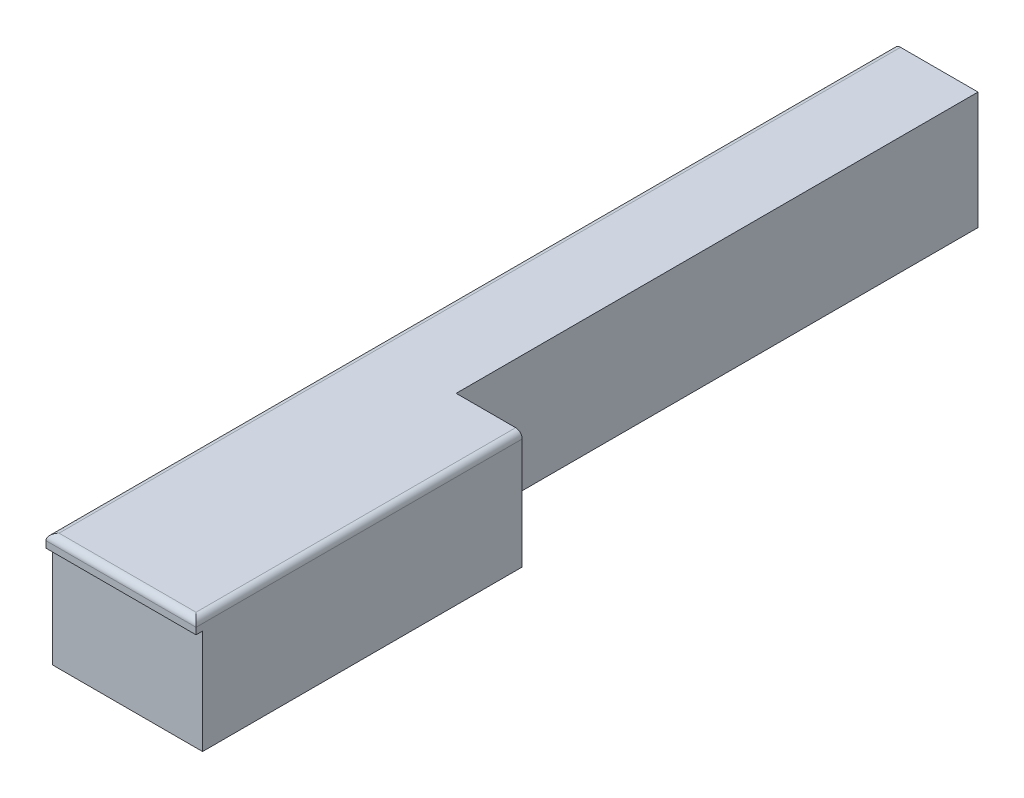
ISO-10303-21;
HEADER;
FILE_DESCRIPTION(('STEP AP214'),'2;1');
FILE_NAME('part.step','',(''),(''),'','','');
FILE_SCHEMA(('AUTOMOTIVE_DESIGN { 1 0 10303 214 1 1 1 1 }'));
ENDSEC;
DATA;
#1=APPLICATION_CONTEXT('core data for automotive mechanical design processes');
#2=APPLICATION_PROTOCOL_DEFINITION('international standard','automotive_design',2000,#1);
#3=PRODUCT_CONTEXT('',#1,'mechanical');
#4=PRODUCT('Part','Part','',(#3));
#5=PRODUCT_RELATED_PRODUCT_CATEGORY('part','',(#4));
#6=PRODUCT_DEFINITION_FORMATION('','',#4);
#7=PRODUCT_DEFINITION_CONTEXT('part definition',#1,'design');
#8=PRODUCT_DEFINITION('design','',#6,#7);
#9=PRODUCT_DEFINITION_SHAPE('','',#8);
#10=(LENGTH_UNIT() NAMED_UNIT(*) SI_UNIT(.MILLI.,.METRE.));
#11=(NAMED_UNIT(*) PLANE_ANGLE_UNIT() SI_UNIT($,.RADIAN.));
#12=(NAMED_UNIT(*) SI_UNIT($,.STERADIAN.) SOLID_ANGLE_UNIT());
#13=UNCERTAINTY_MEASURE_WITH_UNIT(LENGTH_MEASURE(1.E-05),#10,'distance_accuracy_value','');
#14=(GEOMETRIC_REPRESENTATION_CONTEXT(3) GLOBAL_UNCERTAINTY_ASSIGNED_CONTEXT((#13)) GLOBAL_UNIT_ASSIGNED_CONTEXT((#10,
#11,#12)) REPRESENTATION_CONTEXT('',''));
#15=CARTESIAN_POINT('',(0.,0.,0.));
#16=DIRECTION('',(0.,0.,1.));
#17=DIRECTION('',(1.,0.,0.));
#18=AXIS2_PLACEMENT_3D('',#15,#16,#17);
#19=CARTESIAN_POINT('',(0.,18.,-50.));
#20=DIRECTION('',(0.,0.,1.));
#21=DIRECTION('',(1.,0.,0.));
#22=AXIS2_PLACEMENT_3D('',#19,#20,#21);
#23=PLANE('',#22);
#24=DIRECTION('',(-1.,0.,0.));
#25=VECTOR('',#24,1.);
#26=CARTESIAN_POINT('',(0.,18.,-50.));
#27=LINE('',#26,#25);
#28=CARTESIAN_POINT('',(22.,18.,-50.));
#29=VERTEX_POINT('',#28);
#30=CARTESIAN_POINT('',(12.875,18.,-50.));
#31=VERTEX_POINT('',#30);
#32=EDGE_CURVE('E137',#29,#31,#27,.T.);
#33=ORIENTED_EDGE('',*,*,#32,.F.);
#34=CARTESIAN_POINT('',(22.,17.,-50.));
#35=DIRECTION('',(0.,0.,1.));
#36=DIRECTION('',(1.,0.,0.));
#37=AXIS2_PLACEMENT_3D('',#34,#35,#36);
#38=CIRCLE('',#37,0.999999999999997);
#39=CARTESIAN_POINT('',(23.,17.,-50.));
#40=VERTEX_POINT('',#39);
#41=EDGE_CURVE('E59',#29,#40,#38,.F.);
#42=ORIENTED_EDGE('',*,*,#41,.T.);
#43=DIRECTION('',(0.,-1.,0.));
#44=VECTOR('',#43,1.);
#45=CARTESIAN_POINT('',(23.,18.,-50.));
#46=LINE('',#45,#44);
#47=CARTESIAN_POINT('',(23.,0.,-50.));
#48=VERTEX_POINT('',#47);
#49=EDGE_CURVE('E146',#40,#48,#46,.T.);
#50=ORIENTED_EDGE('',*,*,#49,.T.);
#51=DIRECTION('',(-1.,0.,0.));
#52=VECTOR('',#51,1.);
#53=CARTESIAN_POINT('',(0.,0.,-50.));
#54=LINE('',#53,#52);
#55=CARTESIAN_POINT('',(12.875,0.,-50.));
#56=VERTEX_POINT('',#55);
#57=EDGE_CURVE('E136',#48,#56,#54,.T.);
#58=ORIENTED_EDGE('',*,*,#57,.T.);
#59=DIRECTION('',(0.,-1.,0.));
#60=VECTOR('',#59,1.);
#61=CARTESIAN_POINT('',(12.875,18.,-50.));
#62=LINE('',#61,#60);
#63=EDGE_CURVE('E157',#31,#56,#62,.T.);
#64=ORIENTED_EDGE('',*,*,#63,.F.);
#65=EDGE_LOOP('',(#33,#42,#50,#58,#64));
#66=FACE_BOUND('',#65,.T.);
#67=ADVANCED_FACE('F35',(#66),#23,.F.);
#68=CARTESIAN_POINT('',(12.875,18.,0.));
#69=DIRECTION('',(-1.,0.,0.));
#70=DIRECTION('',(0.,0.,1.));
#71=AXIS2_PLACEMENT_3D('',#68,#69,#70);
#72=PLANE('',#71);
#73=DIRECTION('',(0.,0.,-1.));
#74=VECTOR('',#73,1.);
#75=CARTESIAN_POINT('',(12.875,0.,0.));
#76=LINE('',#75,#74);
#77=CARTESIAN_POINT('',(12.875,0.,-130.));
#78=VERTEX_POINT('',#77);
#79=EDGE_CURVE('E199',#56,#78,#76,.T.);
#80=ORIENTED_EDGE('',*,*,#79,.T.);
#81=DIRECTION('',(0.,-1.,0.));
#82=VECTOR('',#81,1.);
#83=CARTESIAN_POINT('',(12.875,18.,-130.));
#84=LINE('',#83,#82);
#85=CARTESIAN_POINT('',(12.875,18.,-130.));
#86=VERTEX_POINT('',#85);
#87=EDGE_CURVE('E155',#86,#78,#84,.T.);
#88=ORIENTED_EDGE('',*,*,#87,.F.);
#89=DIRECTION('',(0.,0.,-1.));
#90=VECTOR('',#89,1.);
#91=CARTESIAN_POINT('',(12.875,18.,0.));
#92=LINE('',#91,#90);
#93=EDGE_CURVE('E140',#31,#86,#92,.T.);
#94=ORIENTED_EDGE('',*,*,#93,.F.);
#95=ORIENTED_EDGE('',*,*,#63,.T.);
#96=EDGE_LOOP('',(#80,#88,#94,#95));
#97=FACE_BOUND('',#96,.T.);
#98=ADVANCED_FACE('F210',(#97),#72,.F.);
#99=CARTESIAN_POINT('',(0.,18.,-130.));
#100=DIRECTION('',(0.,0.,-1.));
#101=DIRECTION('',(-1.,0.,0.));
#102=AXIS2_PLACEMENT_3D('',#99,#100,#101);
#103=PLANE('',#102);
#104=DIRECTION('',(0.,-1.,0.));
#105=VECTOR('',#104,1.);
#106=CARTESIAN_POINT('',(0.,18.,-130.));
#107=LINE('',#106,#105);
#108=CARTESIAN_POINT('',(0.,17.,-130.));
#109=VERTEX_POINT('',#108);
#110=CARTESIAN_POINT('',(0.,0.,-130.));
#111=VERTEX_POINT('',#110);
#112=EDGE_CURVE('E153',#109,#111,#107,.T.);
#113=ORIENTED_EDGE('',*,*,#112,.F.);
#114=CARTESIAN_POINT('',(0.999999999999997,17.,-130.));
#115=DIRECTION('',(0.,0.,-1.));
#116=DIRECTION('',(-1.,0.,0.));
#117=AXIS2_PLACEMENT_3D('',#114,#115,#116);
#118=CIRCLE('',#117,0.999999999999997);
#119=CARTESIAN_POINT('',(0.999999999999997,18.,-130.));
#120=VERTEX_POINT('',#119);
#121=EDGE_CURVE('E163',#109,#120,#118,.T.);
#122=ORIENTED_EDGE('',*,*,#121,.T.);
#123=DIRECTION('',(1.,0.,0.));
#124=VECTOR('',#123,1.);
#125=CARTESIAN_POINT('',(0.,18.,-130.));
#126=LINE('',#125,#124);
#127=EDGE_CURVE('E149',#120,#86,#126,.T.);
#128=ORIENTED_EDGE('',*,*,#127,.T.);
#129=ORIENTED_EDGE('',*,*,#87,.T.);
#130=DIRECTION('',(1.,0.,0.));
#131=VECTOR('',#130,1.);
#132=CARTESIAN_POINT('',(0.,0.,-130.));
#133=LINE('',#132,#131);
#134=EDGE_CURVE('E142',#111,#78,#133,.T.);
#135=ORIENTED_EDGE('',*,*,#134,.F.);
#136=EDGE_LOOP('',(#113,#122,#128,#129,#135));
#137=FACE_BOUND('',#136,.T.);
#138=ADVANCED_FACE('F205',(#137),#103,.T.);
#139=CARTESIAN_POINT('',(0.,18.,0.));
#140=DIRECTION('',(-1.,0.,0.));
#141=DIRECTION('',(0.,0.,1.));
#142=AXIS2_PLACEMENT_3D('',#139,#140,#141);
#143=PLANE('',#142);
#144=DIRECTION('',(0.,-1.,0.));
#145=VECTOR('',#144,1.);
#146=CARTESIAN_POINT('',(0.,18.,0.));
#147=LINE('',#146,#145);
#148=CARTESIAN_POINT('',(0.,17.,0.));
#149=VERTEX_POINT('',#148);
#150=CARTESIAN_POINT('',(0.,16.,0.));
#151=VERTEX_POINT('',#150);
#152=EDGE_CURVE('E151',#149,#151,#147,.T.);
#153=ORIENTED_EDGE('',*,*,#152,.F.);
#154=DIRECTION('',(0.,0.,-1.));
#155=VECTOR('',#154,1.);
#156=CARTESIAN_POINT('',(0.,17.,0.));
#157=LINE('',#156,#155);
#158=EDGE_CURVE('E160',#149,#109,#157,.T.);
#159=ORIENTED_EDGE('',*,*,#158,.T.);
#160=ORIENTED_EDGE('',*,*,#112,.T.);
#161=DIRECTION('',(0.,0.,-1.));
#162=VECTOR('',#161,1.);
#163=CARTESIAN_POINT('',(0.,0.,0.));
#164=LINE('',#163,#162);
#165=CARTESIAN_POINT('',(0.,0.,-1.));
#166=VERTEX_POINT('',#165);
#167=EDGE_CURVE('E138',#166,#111,#164,.T.);
#168=ORIENTED_EDGE('',*,*,#167,.F.);
#169=DIRECTION('',(0.,-1.,0.));
#170=VECTOR('',#169,1.);
#171=CARTESIAN_POINT('',(0.,0.,-1.));
#172=LINE('',#171,#170);
#173=CARTESIAN_POINT('',(0.,16.,-1.));
#174=VERTEX_POINT('',#173);
#175=EDGE_CURVE('E119',#174,#166,#172,.T.);
#176=ORIENTED_EDGE('',*,*,#175,.F.);
#177=DIRECTION('',(0.,0.,1.));
#178=VECTOR('',#177,1.);
#179=CARTESIAN_POINT('',(0.,16.,-1.));
#180=LINE('',#179,#178);
#181=EDGE_CURVE('E192',#174,#151,#180,.T.);
#182=ORIENTED_EDGE('',*,*,#181,.T.);
#183=EDGE_LOOP('',(#153,#159,#160,#168,#176,#182));
#184=FACE_BOUND('',#183,.T.);
#185=ADVANCED_FACE('F219',(#184),#143,.T.);
#186=CARTESIAN_POINT('',(0.,18.,0.));
#187=DIRECTION('',(0.,0.,-1.));
#188=DIRECTION('',(-1.,0.,0.));
#189=AXIS2_PLACEMENT_3D('',#186,#187,#188);
#190=PLANE('',#189);
#191=DIRECTION('',(0.,-1.,0.));
#192=VECTOR('',#191,1.);
#193=CARTESIAN_POINT('',(23.,18.,0.));
#194=LINE('',#193,#192);
#195=CARTESIAN_POINT('',(23.,17.,0.));
#196=VERTEX_POINT('',#195);
#197=CARTESIAN_POINT('',(23.,16.,0.));
#198=VERTEX_POINT('',#197);
#199=EDGE_CURVE('E148',#196,#198,#194,.T.);
#200=ORIENTED_EDGE('',*,*,#199,.F.);
#201=DIRECTION('',(1.,0.,0.));
#202=VECTOR('',#201,1.);
#203=CARTESIAN_POINT('',(0.,17.,0.));
#204=LINE('',#203,#202);
#205=EDGE_CURVE('E11',#196,#149,#204,.F.);
#206=ORIENTED_EDGE('',*,*,#205,.T.);
#207=ORIENTED_EDGE('',*,*,#152,.T.);
#208=DIRECTION('',(-1.,0.,0.));
#209=VECTOR('',#208,1.);
#210=CARTESIAN_POINT('',(0.,16.,0.));
#211=LINE('',#210,#209);
#212=EDGE_CURVE('E179',#198,#151,#211,.T.);
#213=ORIENTED_EDGE('',*,*,#212,.F.);
#214=EDGE_LOOP('',(#200,#206,#207,#213));
#215=FACE_BOUND('',#214,.T.);
#216=ADVANCED_FACE('F217',(#215),#190,.F.);
#217=CARTESIAN_POINT('',(23.,18.,0.));
#218=DIRECTION('',(-1.,0.,0.));
#219=DIRECTION('',(0.,0.,1.));
#220=AXIS2_PLACEMENT_3D('',#217,#218,#219);
#221=PLANE('',#220);
#222=ORIENTED_EDGE('',*,*,#49,.F.);
#223=DIRECTION('',(0.,0.,-1.));
#224=VECTOR('',#223,1.);
#225=CARTESIAN_POINT('',(23.,17.,0.));
#226=LINE('',#225,#224);
#227=EDGE_CURVE('E44',#40,#196,#226,.F.);
#228=ORIENTED_EDGE('',*,*,#227,.T.);
#229=ORIENTED_EDGE('',*,*,#199,.T.);
#230=DIRECTION('',(0.,0.,1.));
#231=VECTOR('',#230,1.);
#232=CARTESIAN_POINT('',(23.,16.,-1.));
#233=LINE('',#232,#231);
#234=CARTESIAN_POINT('',(23.,16.,-1.));
#235=VERTEX_POINT('',#234);
#236=EDGE_CURVE('E131',#235,#198,#233,.T.);
#237=ORIENTED_EDGE('',*,*,#236,.F.);
#238=DIRECTION('',(0.,1.,0.));
#239=VECTOR('',#238,1.);
#240=CARTESIAN_POINT('',(23.,0.,-1.));
#241=LINE('',#240,#239);
#242=CARTESIAN_POINT('',(23.,0.,-1.));
#243=VERTEX_POINT('',#242);
#244=EDGE_CURVE('E116',#243,#235,#241,.T.);
#245=ORIENTED_EDGE('',*,*,#244,.F.);
#246=DIRECTION('',(0.,0.,-1.));
#247=VECTOR('',#246,1.);
#248=CARTESIAN_POINT('',(23.,0.,0.));
#249=LINE('',#248,#247);
#250=EDGE_CURVE('E128',#243,#48,#249,.T.);
#251=ORIENTED_EDGE('',*,*,#250,.T.);
#252=EDGE_LOOP('',(#222,#228,#229,#237,#245,#251));
#253=FACE_BOUND('',#252,.T.);
#254=ADVANCED_FACE('F127',(#253),#221,.F.);
#255=CARTESIAN_POINT('',(0.,18.,0.));
#256=DIRECTION('',(0.,1.,0.));
#257=DIRECTION('',(0.,0.,1.));
#258=AXIS2_PLACEMENT_3D('',#255,#256,#257);
#259=PLANE('',#258);
#260=ORIENTED_EDGE('',*,*,#127,.F.);
#261=DIRECTION('',(0.,0.,-1.));
#262=VECTOR('',#261,1.);
#263=CARTESIAN_POINT('',(0.999999999999997,18.,0.));
#264=LINE('',#263,#262);
#265=CARTESIAN_POINT('',(0.999999999999997,18.,-0.999999999999997));
#266=VERTEX_POINT('',#265);
#267=EDGE_CURVE('E169',#120,#266,#264,.F.);
#268=ORIENTED_EDGE('',*,*,#267,.T.);
#269=DIRECTION('',(1.,0.,0.));
#270=VECTOR('',#269,1.);
#271=CARTESIAN_POINT('',(23.,18.,-0.999999999999997));
#272=LINE('',#271,#270);
#273=CARTESIAN_POINT('',(22.,18.,-0.999999999999997));
#274=VERTEX_POINT('',#273);
#275=EDGE_CURVE('E165',#266,#274,#272,.T.);
#276=ORIENTED_EDGE('',*,*,#275,.T.);
#277=DIRECTION('',(0.,0.,-1.));
#278=VECTOR('',#277,1.);
#279=CARTESIAN_POINT('',(22.,18.,-50.));
#280=LINE('',#279,#278);
#281=EDGE_CURVE('E167',#274,#29,#280,.T.);
#282=ORIENTED_EDGE('',*,*,#281,.T.);
#283=ORIENTED_EDGE('',*,*,#32,.T.);
#284=ORIENTED_EDGE('',*,*,#93,.T.);
#285=EDGE_LOOP('',(#260,#268,#276,#282,#283,#284));
#286=FACE_BOUND('',#285,.T.);
#287=ADVANCED_FACE('F228',(#286),#259,.T.);
#288=CARTESIAN_POINT('',(0.,0.,0.));
#289=DIRECTION('',(0.,1.,0.));
#290=DIRECTION('',(0.,0.,1.));
#291=AXIS2_PLACEMENT_3D('',#288,#289,#290);
#292=PLANE('',#291);
#293=ORIENTED_EDGE('',*,*,#250,.F.);
#294=DIRECTION('',(1.,0.,0.));
#295=VECTOR('',#294,1.);
#296=CARTESIAN_POINT('',(0.,0.,-1.));
#297=LINE('',#296,#295);
#298=EDGE_CURVE('E112',#166,#243,#297,.T.);
#299=ORIENTED_EDGE('',*,*,#298,.F.);
#300=ORIENTED_EDGE('',*,*,#167,.T.);
#301=ORIENTED_EDGE('',*,*,#134,.T.);
#302=ORIENTED_EDGE('',*,*,#79,.F.);
#303=ORIENTED_EDGE('',*,*,#57,.F.);
#304=EDGE_LOOP('',(#293,#299,#300,#301,#302,#303));
#305=FACE_BOUND('',#304,.T.);
#306=ADVANCED_FACE('F134',(#305),#292,.F.);
#307=CARTESIAN_POINT('',(0.,16.,-1.));
#308=DIRECTION('',(0.,1.,0.));
#309=DIRECTION('',(0.,0.,1.));
#310=AXIS2_PLACEMENT_3D('',#307,#308,#309);
#311=PLANE('',#310);
#312=ORIENTED_EDGE('',*,*,#212,.T.);
#313=ORIENTED_EDGE('',*,*,#181,.F.);
#314=DIRECTION('',(-1.,0.,0.));
#315=VECTOR('',#314,1.);
#316=CARTESIAN_POINT('',(0.,16.,-1.));
#317=LINE('',#316,#315);
#318=EDGE_CURVE('E132',#235,#174,#317,.T.);
#319=ORIENTED_EDGE('',*,*,#318,.F.);
#320=ORIENTED_EDGE('',*,*,#236,.T.);
#321=EDGE_LOOP('',(#312,#313,#319,#320));
#322=FACE_BOUND('',#321,.T.);
#323=ADVANCED_FACE('F220',(#322),#311,.F.);
#324=CARTESIAN_POINT('',(0.,0.,-1.));
#325=DIRECTION('',(0.,0.,-1.));
#326=DIRECTION('',(-1.,0.,0.));
#327=AXIS2_PLACEMENT_3D('',#324,#325,#326);
#328=PLANE('',#327);
#329=ORIENTED_EDGE('',*,*,#175,.T.);
#330=ORIENTED_EDGE('',*,*,#298,.T.);
#331=ORIENTED_EDGE('',*,*,#244,.T.);
#332=ORIENTED_EDGE('',*,*,#318,.T.);
#333=EDGE_LOOP('',(#329,#330,#331,#332));
#334=FACE_BOUND('',#333,.T.);
#335=ADVANCED_FACE('F114',(#334),#328,.F.);
#336=CARTESIAN_POINT('',(22.,17.,0.));
#337=DIRECTION('',(0.,0.,1.));
#338=DIRECTION('',(1.,0.,0.));
#339=AXIS2_PLACEMENT_3D('',#336,#337,#338);
#340=CYLINDRICAL_SURFACE('',#339,0.999999999999997);
#341=ORIENTED_EDGE('',*,*,#41,.F.);
#342=ORIENTED_EDGE('',*,*,#281,.F.);
#343=CARTESIAN_POINT('',(22.,17.,-0.999999999999997));
#344=DIRECTION('',(-0.707106781186547,0.,0.707106781186547));
#345=DIRECTION('',(-0.707106781186547,0.,-0.707106781186547));
#346=AXIS2_PLACEMENT_3D('',#343,#344,#345);
#347=ELLIPSE('',#346,1.41421356237309,0.999999999999997);
#348=EDGE_CURVE('E39',#196,#274,#347,.T.);
#349=ORIENTED_EDGE('',*,*,#348,.F.);
#350=ORIENTED_EDGE('',*,*,#227,.F.);
#351=EDGE_LOOP('',(#341,#342,#349,#350));
#352=FACE_BOUND('',#351,.T.);
#353=ADVANCED_FACE('F37',(#352),#340,.T.);
#354=CARTESIAN_POINT('',(0.,17.,-0.999999999999997));
#355=DIRECTION('',(-1.,0.,0.));
#356=DIRECTION('',(0.,0.,1.));
#357=AXIS2_PLACEMENT_3D('',#354,#355,#356);
#358=CYLINDRICAL_SURFACE('',#357,0.999999999999997);
#359=ORIENTED_EDGE('',*,*,#348,.T.);
#360=ORIENTED_EDGE('',*,*,#275,.F.);
#361=CARTESIAN_POINT('',(0.999999999999997,17.,-0.999999999999997));
#362=DIRECTION('',(-0.707106781186547,0.,-0.707106781186547));
#363=DIRECTION('',(-0.707106781186547,0.,0.707106781186547));
#364=AXIS2_PLACEMENT_3D('',#361,#362,#363);
#365=ELLIPSE('',#364,1.41421356237309,0.999999999999997);
#366=EDGE_CURVE('E172',#149,#266,#365,.T.);
#367=ORIENTED_EDGE('',*,*,#366,.F.);
#368=ORIENTED_EDGE('',*,*,#205,.F.);
#369=EDGE_LOOP('',(#359,#360,#367,#368));
#370=FACE_BOUND('',#369,.T.);
#371=ADVANCED_FACE('F214',(#370),#358,.T.);
#372=CARTESIAN_POINT('',(0.999999999999997,17.,0.));
#373=DIRECTION('',(0.,0.,-1.));
#374=DIRECTION('',(-1.,0.,0.));
#375=AXIS2_PLACEMENT_3D('',#372,#373,#374);
#376=CYLINDRICAL_SURFACE('',#375,0.999999999999997);
#377=ORIENTED_EDGE('',*,*,#366,.T.);
#378=ORIENTED_EDGE('',*,*,#267,.F.);
#379=ORIENTED_EDGE('',*,*,#121,.F.);
#380=ORIENTED_EDGE('',*,*,#158,.F.);
#381=EDGE_LOOP('',(#377,#378,#379,#380));
#382=FACE_BOUND('',#381,.T.);
#383=ADVANCED_FACE('F239',(#382),#376,.T.);
#384=CLOSED_SHELL('',(#67,#98,#138,#185,#216,#254,#287,#306,#323,#335,#353,#371,#383));
#385=MANIFOLD_SOLID_BREP('B2',#384);
#386=ADVANCED_BREP_SHAPE_REPRESENTATION('',(#18,#385),#14);
#387=SHAPE_DEFINITION_REPRESENTATION(#9,#386);
ENDSEC;
END-ISO-10303-21;
